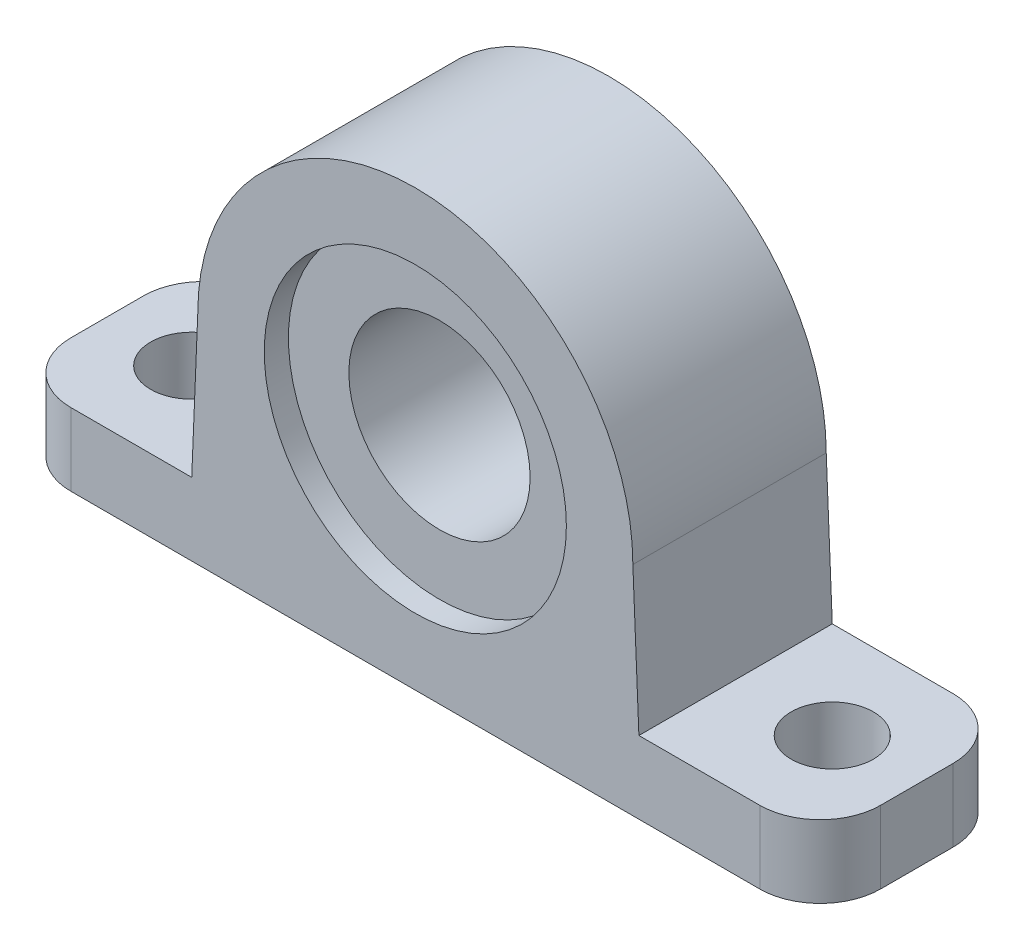
ISO-10303-21;
HEADER;
FILE_DESCRIPTION(('STEP AP214'),'2;1');
FILE_NAME('part.step','',(''),(''),'','','');
FILE_SCHEMA(('AUTOMOTIVE_DESIGN { 1 0 10303 214 1 1 1 1 }'));
ENDSEC;
DATA;
#1=APPLICATION_CONTEXT('core data for automotive mechanical design processes');
#2=APPLICATION_PROTOCOL_DEFINITION('international standard','automotive_design',2000,#1);
#3=PRODUCT_CONTEXT('',#1,'mechanical');
#4=PRODUCT('Part','Part','',(#3));
#5=PRODUCT_RELATED_PRODUCT_CATEGORY('part','',(#4));
#6=PRODUCT_DEFINITION_FORMATION('','',#4);
#7=PRODUCT_DEFINITION_CONTEXT('part definition',#1,'design');
#8=PRODUCT_DEFINITION('design','',#6,#7);
#9=PRODUCT_DEFINITION_SHAPE('','',#8);
#10=(LENGTH_UNIT() NAMED_UNIT(*) SI_UNIT(.MILLI.,.METRE.));
#11=(NAMED_UNIT(*) PLANE_ANGLE_UNIT() SI_UNIT($,.RADIAN.));
#12=(NAMED_UNIT(*) SI_UNIT($,.STERADIAN.) SOLID_ANGLE_UNIT());
#13=UNCERTAINTY_MEASURE_WITH_UNIT(LENGTH_MEASURE(1.E-05),#10,'distance_accuracy_value','');
#14=(GEOMETRIC_REPRESENTATION_CONTEXT(3) GLOBAL_UNCERTAINTY_ASSIGNED_CONTEXT((#13)) GLOBAL_UNIT_ASSIGNED_CONTEXT((#10,
#11,#12)) REPRESENTATION_CONTEXT('',''));
#15=CARTESIAN_POINT('',(0.,0.,0.));
#16=DIRECTION('',(0.,0.,1.));
#17=DIRECTION('',(1.,0.,0.));
#18=AXIS2_PLACEMENT_3D('',#15,#16,#17);
#19=CARTESIAN_POINT('',(-5.94368208875187,13.7784552845528,2.));
#20=DIRECTION('',(0.,0.,1.));
#21=DIRECTION('',(1.,0.,0.));
#22=AXIS2_PLACEMENT_3D('',#19,#20,#21);
#23=PLANE('',#22);
#24=CARTESIAN_POINT('',(-5.94368208875187,13.7784552845528,2.));
#25=DIRECTION('',(0.,0.,1.));
#26=DIRECTION('',(1.,0.,0.));
#27=AXIS2_PLACEMENT_3D('',#24,#25,#26);
#28=CIRCLE('',#27,12.5);
#29=CARTESIAN_POINT('',(6.55631791124813,13.7784552845528,2.));
#30=VERTEX_POINT('',#29);
#31=EDGE_CURVE('E258',#30,#30,#28,.T.);
#32=ORIENTED_EDGE('',*,*,#31,.F.);
#33=EDGE_LOOP('',(#32));
#34=FACE_BOUND('',#33,.T.);
#35=CARTESIAN_POINT('',(-5.94368208875187,13.7784552845528,2.));
#36=DIRECTION('',(0.,0.,1.));
#37=DIRECTION('',(1.,0.,0.));
#38=AXIS2_PLACEMENT_3D('',#35,#36,#37);
#39=CIRCLE('',#38,8.5);
#40=CARTESIAN_POINT('',(2.55631791124813,13.7784552845528,2.));
#41=VERTEX_POINT('',#40);
#42=EDGE_CURVE('E161',#41,#41,#39,.F.);
#43=ORIENTED_EDGE('',*,*,#42,.F.);
#44=EDGE_LOOP('',(#43));
#45=FACE_BOUND('',#44,.T.);
#46=ADVANCED_FACE('F41',(#34,#45),#23,.F.);
#47=CARTESIAN_POINT('',(-5.94368208875187,13.7784552845528,16.));
#48=DIRECTION('',(0.,0.,-1.));
#49=DIRECTION('',(-1.,0.,0.));
#50=AXIS2_PLACEMENT_3D('',#47,#48,#49);
#51=CYLINDRICAL_SURFACE('',#50,7.5);
#52=CARTESIAN_POINT('',(-5.94368208875187,13.7784552845528,14.));
#53=DIRECTION('',(0.,0.,1.));
#54=DIRECTION('',(1.,0.,0.));
#55=AXIS2_PLACEMENT_3D('',#52,#53,#54);
#56=CIRCLE('',#55,7.5);
#57=CARTESIAN_POINT('',(1.55631791124813,13.7784552845528,14.));
#58=VERTEX_POINT('',#57);
#59=EDGE_CURVE('E173',#58,#58,#56,.T.);
#60=ORIENTED_EDGE('',*,*,#59,.T.);
#61=EDGE_LOOP('',(#60));
#62=FACE_BOUND('',#61,.T.);
#63=CARTESIAN_POINT('',(-5.94368208875187,13.7784552845528,-3.));
#64=DIRECTION('',(0.,0.,-1.));
#65=DIRECTION('',(-1.,0.,0.));
#66=AXIS2_PLACEMENT_3D('',#63,#64,#65);
#67=CIRCLE('',#66,7.5);
#68=CARTESIAN_POINT('',(-13.4436820887519,13.7784552845528,-3.));
#69=VERTEX_POINT('',#68);
#70=EDGE_CURVE('E243',#69,#69,#67,.T.);
#71=ORIENTED_EDGE('',*,*,#70,.T.);
#72=EDGE_LOOP('',(#71));
#73=FACE_BOUND('',#72,.T.);
#74=ADVANCED_FACE('F350',(#62,#73),#51,.F.);
#75=CARTESIAN_POINT('',(-5.94368208875187,13.7784552845528,16.));
#76=DIRECTION('',(0.,0.,1.));
#77=DIRECTION('',(1.,0.,0.));
#78=AXIS2_PLACEMENT_3D('',#75,#76,#77);
#79=PLANE('',#78);
#80=CARTESIAN_POINT('',(-5.94368208875187,13.7784552845528,16.));
#81=DIRECTION('',(0.,0.,1.));
#82=DIRECTION('',(1.,0.,0.));
#83=AXIS2_PLACEMENT_3D('',#80,#81,#82);
#84=CIRCLE('',#83,12.5);
#85=CARTESIAN_POINT('',(6.55631791124813,13.7784552845528,16.));
#86=VERTEX_POINT('',#85);
#87=EDGE_CURVE('E251',#86,#86,#84,.T.);
#88=ORIENTED_EDGE('',*,*,#87,.F.);
#89=EDGE_LOOP('',(#88));
#90=FACE_BOUND('',#89,.T.);
#91=DIRECTION('',(1.,0.,0.));
#92=VECTOR('',#91,1.);
#93=CARTESIAN_POINT('',(-39.4436820887519,-4.22154471544718,16.));
#94=LINE('',#93,#92);
#95=CARTESIAN_POINT('',(-34.4436820887519,-4.22154471544718,16.));
#96=VERTEX_POINT('',#95);
#97=CARTESIAN_POINT('',(22.5563179112481,-4.22154471544718,16.));
#98=VERTEX_POINT('',#97);
#99=EDGE_CURVE('E143',#96,#98,#94,.T.);
#100=ORIENTED_EDGE('',*,*,#99,.T.);
#101=DIRECTION('',(0.,1.,0.));
#102=VECTOR('',#101,1.);
#103=CARTESIAN_POINT('',(22.5563179112481,1.77845528455283,16.));
#104=LINE('',#103,#102);
#105=CARTESIAN_POINT('',(22.5563179112481,1.77845528455283,16.));
#106=VERTEX_POINT('',#105);
#107=EDGE_CURVE('E196',#98,#106,#104,.T.);
#108=ORIENTED_EDGE('',*,*,#107,.T.);
#109=DIRECTION('',(-1.,0.,0.));
#110=VECTOR('',#109,1.);
#111=CARTESIAN_POINT('',(27.5563179112481,1.77845528455283,16.));
#112=LINE('',#111,#110);
#113=CARTESIAN_POINT('',(12.5563179112481,1.77845528455283,16.));
#114=VERTEX_POINT('',#113);
#115=EDGE_CURVE('E267',#106,#114,#112,.T.);
#116=ORIENTED_EDGE('',*,*,#115,.T.);
#117=DIRECTION('',(-0.0416305447121817,0.999133073092352,0.));
#118=VECTOR('',#117,1.);
#119=CARTESIAN_POINT('',(12.0563179112481,13.7784552845528,16.));
#120=LINE('',#119,#118);
#121=CARTESIAN_POINT('',(12.0563179112481,13.7784552845528,16.));
#122=VERTEX_POINT('',#121);
#123=EDGE_CURVE('E270',#114,#122,#120,.T.);
#124=ORIENTED_EDGE('',*,*,#123,.T.);
#125=CARTESIAN_POINT('',(-5.94368208875187,13.7784552845528,16.));
#126=DIRECTION('',(0.,0.,1.));
#127=DIRECTION('',(1.,0.,0.));
#128=AXIS2_PLACEMENT_3D('',#125,#126,#127);
#129=CIRCLE('',#128,18.);
#130=CARTESIAN_POINT('',(-23.9436820887519,13.7784552845528,16.));
#131=VERTEX_POINT('',#130);
#132=EDGE_CURVE('E150',#122,#131,#129,.T.);
#133=ORIENTED_EDGE('',*,*,#132,.T.);
#134=DIRECTION('',(-0.0416305447121817,-0.999133073092352,0.));
#135=VECTOR('',#134,1.);
#136=CARTESIAN_POINT('',(-23.9436820887519,13.7784552845528,16.));
#137=LINE('',#136,#135);
#138=CARTESIAN_POINT('',(-24.4436820887519,1.77845528455283,16.));
#139=VERTEX_POINT('',#138);
#140=EDGE_CURVE('E144',#131,#139,#137,.T.);
#141=ORIENTED_EDGE('',*,*,#140,.T.);
#142=DIRECTION('',(-1.,0.,0.));
#143=VECTOR('',#142,1.);
#144=CARTESIAN_POINT('',(-24.4436820887519,1.77845528455283,16.));
#145=LINE('',#144,#143);
#146=CARTESIAN_POINT('',(-34.4436820887519,1.77845528455282,16.));
#147=VERTEX_POINT('',#146);
#148=EDGE_CURVE('E132',#139,#147,#145,.T.);
#149=ORIENTED_EDGE('',*,*,#148,.T.);
#150=DIRECTION('',(0.,-1.,0.));
#151=VECTOR('',#150,1.);
#152=CARTESIAN_POINT('',(-34.4436820887519,-4.22154471544718,16.));
#153=LINE('',#152,#151);
#154=EDGE_CURVE('E193',#147,#96,#153,.T.);
#155=ORIENTED_EDGE('',*,*,#154,.T.);
#156=EDGE_LOOP('',(#100,#108,#116,#124,#133,#141,#149,#155));
#157=FACE_BOUND('',#156,.T.);
#158=ADVANCED_FACE('F148',(#90,#157),#79,.T.);
#159=CARTESIAN_POINT('',(-5.94368208875187,13.7784552845528,0.));
#160=DIRECTION('',(0.,0.,1.));
#161=DIRECTION('',(1.,0.,0.));
#162=AXIS2_PLACEMENT_3D('',#159,#160,#161);
#163=PLANE('',#162);
#164=CARTESIAN_POINT('',(-5.94368208875187,13.7784552845528,0.));
#165=DIRECTION('',(0.,0.,1.));
#166=DIRECTION('',(1.,0.,0.));
#167=AXIS2_PLACEMENT_3D('',#164,#165,#166);
#168=CIRCLE('',#167,12.5);
#169=CARTESIAN_POINT('',(6.55631791124813,13.7784552845528,0.));
#170=VERTEX_POINT('',#169);
#171=EDGE_CURVE('E176',#170,#170,#168,.T.);
#172=ORIENTED_EDGE('',*,*,#171,.T.);
#173=EDGE_LOOP('',(#172));
#174=FACE_BOUND('',#173,.T.);
#175=DIRECTION('',(1.,0.,0.));
#176=VECTOR('',#175,1.);
#177=CARTESIAN_POINT('',(-39.4436820887519,-4.22154471544718,0.));
#178=LINE('',#177,#176);
#179=CARTESIAN_POINT('',(-34.4436820887519,-4.22154471544718,0.));
#180=VERTEX_POINT('',#179);
#181=CARTESIAN_POINT('',(22.5563179112481,-4.22154471544718,0.));
#182=VERTEX_POINT('',#181);
#183=EDGE_CURVE('E281',#180,#182,#178,.T.);
#184=ORIENTED_EDGE('',*,*,#183,.F.);
#185=DIRECTION('',(0.,-1.,0.));
#186=VECTOR('',#185,1.);
#187=CARTESIAN_POINT('',(-34.4436820887519,13.7784552845528,0.));
#188=LINE('',#187,#186);
#189=CARTESIAN_POINT('',(-34.4436820887519,1.77845528455282,0.));
#190=VERTEX_POINT('',#189);
#191=EDGE_CURVE('E11',#180,#190,#188,.F.);
#192=ORIENTED_EDGE('',*,*,#191,.T.);
#193=DIRECTION('',(-1.,0.,0.));
#194=VECTOR('',#193,1.);
#195=CARTESIAN_POINT('',(-24.4436820887519,1.77845528455283,0.));
#196=LINE('',#195,#194);
#197=CARTESIAN_POINT('',(-24.4436820887519,1.77845528455283,0.));
#198=VERTEX_POINT('',#197);
#199=EDGE_CURVE('E278',#198,#190,#196,.T.);
#200=ORIENTED_EDGE('',*,*,#199,.F.);
#201=DIRECTION('',(-0.0416305447121817,-0.999133073092352,0.));
#202=VECTOR('',#201,1.);
#203=CARTESIAN_POINT('',(-23.9436820887519,13.7784552845528,0.));
#204=LINE('',#203,#202);
#205=CARTESIAN_POINT('',(-23.9436820887519,13.7784552845528,0.));
#206=VERTEX_POINT('',#205);
#207=EDGE_CURVE('E159',#206,#198,#204,.T.);
#208=ORIENTED_EDGE('',*,*,#207,.F.);
#209=CARTESIAN_POINT('',(-5.94368208875187,13.7784552845528,0.));
#210=DIRECTION('',(0.,0.,1.));
#211=DIRECTION('',(1.,0.,0.));
#212=AXIS2_PLACEMENT_3D('',#209,#210,#211);
#213=CIRCLE('',#212,18.);
#214=CARTESIAN_POINT('',(12.0563179112481,13.7784552845528,0.));
#215=VERTEX_POINT('',#214);
#216=EDGE_CURVE('E155',#215,#206,#213,.T.);
#217=ORIENTED_EDGE('',*,*,#216,.F.);
#218=DIRECTION('',(-0.0416305447121817,0.999133073092352,0.));
#219=VECTOR('',#218,1.);
#220=CARTESIAN_POINT('',(12.0563179112481,13.7784552845528,0.));
#221=LINE('',#220,#219);
#222=CARTESIAN_POINT('',(12.5563179112481,1.77845528455283,0.));
#223=VERTEX_POINT('',#222);
#224=EDGE_CURVE('E287',#223,#215,#221,.T.);
#225=ORIENTED_EDGE('',*,*,#224,.F.);
#226=DIRECTION('',(-1.,0.,0.));
#227=VECTOR('',#226,1.);
#228=CARTESIAN_POINT('',(27.5563179112481,1.77845528455283,0.));
#229=LINE('',#228,#227);
#230=CARTESIAN_POINT('',(22.5563179112481,1.77845528455283,0.));
#231=VERTEX_POINT('',#230);
#232=EDGE_CURVE('E284',#231,#223,#229,.T.);
#233=ORIENTED_EDGE('',*,*,#232,.F.);
#234=DIRECTION('',(0.,1.,0.));
#235=VECTOR('',#234,1.);
#236=CARTESIAN_POINT('',(22.5563179112481,13.7784552845528,0.));
#237=LINE('',#236,#235);
#238=EDGE_CURVE('E185',#231,#182,#237,.F.);
#239=ORIENTED_EDGE('',*,*,#238,.T.);
#240=EDGE_LOOP('',(#184,#192,#200,#208,#217,#225,#233,#239));
#241=FACE_BOUND('',#240,.T.);
#242=ADVANCED_FACE('F339',(#174,#241),#163,.F.);
#243=CARTESIAN_POINT('',(-23.9436820887519,13.7784552845528,16.));
#244=DIRECTION('',(0.999133073092352,-0.0416305447121817,0.));
#245=DIRECTION('',(0.0416305447121817,0.999133073092352,0.));
#246=AXIS2_PLACEMENT_3D('',#243,#244,#245);
#247=PLANE('',#246);
#248=ORIENTED_EDGE('',*,*,#207,.T.);
#249=DIRECTION('',(0.,0.,-1.));
#250=VECTOR('',#249,1.);
#251=CARTESIAN_POINT('',(-24.4436820887519,1.77845528455283,16.));
#252=LINE('',#251,#250);
#253=EDGE_CURVE('E136',#139,#198,#252,.T.);
#254=ORIENTED_EDGE('',*,*,#253,.F.);
#255=ORIENTED_EDGE('',*,*,#140,.F.);
#256=DIRECTION('',(0.,0.,-1.));
#257=VECTOR('',#256,1.);
#258=CARTESIAN_POINT('',(-23.9436820887519,13.7784552845528,16.));
#259=LINE('',#258,#257);
#260=EDGE_CURVE('E275',#131,#206,#259,.T.);
#261=ORIENTED_EDGE('',*,*,#260,.T.);
#262=EDGE_LOOP('',(#248,#254,#255,#261));
#263=FACE_BOUND('',#262,.T.);
#264=ADVANCED_FACE('F157',(#263),#247,.F.);
#265=CARTESIAN_POINT('',(-24.4436820887519,1.77845528455283,16.));
#266=DIRECTION('',(0.,-1.,0.));
#267=DIRECTION('',(1.,0.,0.));
#268=AXIS2_PLACEMENT_3D('',#265,#266,#267);
#269=PLANE('',#268);
#270=CARTESIAN_POINT('',(-32.4436820887519,1.77845528455282,8.00000000000001));
#271=DIRECTION('',(0.,-1.,0.));
#272=DIRECTION('',(1.,0.,0.));
#273=AXIS2_PLACEMENT_3D('',#270,#271,#272);
#274=CIRCLE('',#273,3.4);
#275=CARTESIAN_POINT('',(-29.0436820887519,1.77845528455282,8.00000000000001));
#276=VERTEX_POINT('',#275);
#277=EDGE_CURVE('E238',#276,#276,#274,.F.);
#278=ORIENTED_EDGE('',*,*,#277,.F.);
#279=EDGE_LOOP('',(#278));
#280=FACE_BOUND('',#279,.T.);
#281=DIRECTION('',(0.,0.,-1.));
#282=VECTOR('',#281,1.);
#283=CARTESIAN_POINT('',(-39.4436820887519,1.77845528455282,16.));
#284=LINE('',#283,#282);
#285=CARTESIAN_POINT('',(-39.4436820887519,1.77845528455282,11.));
#286=VERTEX_POINT('',#285);
#287=CARTESIAN_POINT('',(-39.4436820887519,1.77845528455282,5.));
#288=VERTEX_POINT('',#287);
#289=EDGE_CURVE('E162',#286,#288,#284,.T.);
#290=ORIENTED_EDGE('',*,*,#289,.F.);
#291=CARTESIAN_POINT('',(-34.4436820887519,1.77845528455282,11.));
#292=DIRECTION('',(0.,-1.,0.));
#293=DIRECTION('',(1.,0.,0.));
#294=AXIS2_PLACEMENT_3D('',#291,#292,#293);
#295=CIRCLE('',#294,5.);
#296=EDGE_CURVE('E51',#286,#147,#295,.F.);
#297=ORIENTED_EDGE('',*,*,#296,.T.);
#298=ORIENTED_EDGE('',*,*,#148,.F.);
#299=ORIENTED_EDGE('',*,*,#253,.T.);
#300=ORIENTED_EDGE('',*,*,#199,.T.);
#301=CARTESIAN_POINT('',(-34.4436820887519,1.77845528455282,5.));
#302=DIRECTION('',(0.,-1.,0.));
#303=DIRECTION('',(1.,0.,0.));
#304=AXIS2_PLACEMENT_3D('',#301,#302,#303);
#305=CIRCLE('',#304,5.);
#306=EDGE_CURVE('E64',#190,#288,#305,.F.);
#307=ORIENTED_EDGE('',*,*,#306,.T.);
#308=EDGE_LOOP('',(#290,#297,#298,#299,#300,#307));
#309=FACE_BOUND('',#308,.T.);
#310=ADVANCED_FACE('F134',(#280,#309),#269,.F.);
#311=CARTESIAN_POINT('',(-39.4436820887519,1.77845528455282,16.));
#312=DIRECTION('',(1.,0.,0.));
#313=DIRECTION('',(0.,0.,-1.));
#314=AXIS2_PLACEMENT_3D('',#311,#312,#313);
#315=PLANE('',#314);
#316=DIRECTION('',(0.,0.,-1.));
#317=VECTOR('',#316,1.);
#318=CARTESIAN_POINT('',(-39.4436820887519,-4.22154471544718,16.));
#319=LINE('',#318,#317);
#320=CARTESIAN_POINT('',(-39.4436820887519,-4.22154471544718,11.));
#321=VERTEX_POINT('',#320);
#322=CARTESIAN_POINT('',(-39.4436820887519,-4.22154471544718,5.));
#323=VERTEX_POINT('',#322);
#324=EDGE_CURVE('E169',#321,#323,#319,.T.);
#325=ORIENTED_EDGE('',*,*,#324,.F.);
#326=DIRECTION('',(0.,-1.,0.));
#327=VECTOR('',#326,1.);
#328=CARTESIAN_POINT('',(-39.4436820887519,1.77845528455282,11.));
#329=LINE('',#328,#327);
#330=EDGE_CURVE('E219',#321,#286,#329,.F.);
#331=ORIENTED_EDGE('',*,*,#330,.T.);
#332=ORIENTED_EDGE('',*,*,#289,.T.);
#333=DIRECTION('',(0.,-1.,0.));
#334=VECTOR('',#333,1.);
#335=CARTESIAN_POINT('',(-39.4436820887519,1.77845528455282,5.));
#336=LINE('',#335,#334);
#337=EDGE_CURVE('E215',#288,#323,#336,.T.);
#338=ORIENTED_EDGE('',*,*,#337,.T.);
#339=EDGE_LOOP('',(#325,#331,#332,#338));
#340=FACE_BOUND('',#339,.T.);
#341=ADVANCED_FACE('F316',(#340),#315,.F.);
#342=CARTESIAN_POINT('',(-39.4436820887519,-4.22154471544718,16.));
#343=DIRECTION('',(0.,1.,0.));
#344=DIRECTION('',(0.,0.,1.));
#345=AXIS2_PLACEMENT_3D('',#342,#343,#344);
#346=PLANE('',#345);
#347=CARTESIAN_POINT('',(-32.4436820887519,-4.22154471544717,8.00000000000001));
#348=DIRECTION('',(0.,1.,0.));
#349=DIRECTION('',(0.,0.,1.));
#350=AXIS2_PLACEMENT_3D('',#347,#348,#349);
#351=CIRCLE('',#350,3.4);
#352=CARTESIAN_POINT('',(-32.4436820887519,-4.22154471544717,11.4));
#353=VERTEX_POINT('',#352);
#354=EDGE_CURVE('E45',#353,#353,#351,.F.);
#355=ORIENTED_EDGE('',*,*,#354,.F.);
#356=EDGE_LOOP('',(#355));
#357=FACE_BOUND('',#356,.T.);
#358=CARTESIAN_POINT('',(20.5563179112481,-4.22154471544717,8.00000000000001));
#359=DIRECTION('',(0.,1.,0.));
#360=DIRECTION('',(0.,0.,1.));
#361=AXIS2_PLACEMENT_3D('',#358,#359,#360);
#362=CIRCLE('',#361,3.4);
#363=CARTESIAN_POINT('',(20.5563179112481,-4.22154471544717,11.4));
#364=VERTEX_POINT('',#363);
#365=EDGE_CURVE('E228',#364,#364,#362,.F.);
#366=ORIENTED_EDGE('',*,*,#365,.F.);
#367=EDGE_LOOP('',(#366));
#368=FACE_BOUND('',#367,.T.);
#369=DIRECTION('',(0.,0.,-1.));
#370=VECTOR('',#369,1.);
#371=CARTESIAN_POINT('',(27.5563179112481,-4.22154471544718,16.));
#372=LINE('',#371,#370);
#373=CARTESIAN_POINT('',(27.5563179112481,-4.22154471544718,11.));
#374=VERTEX_POINT('',#373);
#375=CARTESIAN_POINT('',(27.5563179112481,-4.22154471544718,5.));
#376=VERTEX_POINT('',#375);
#377=EDGE_CURVE('E305',#374,#376,#372,.T.);
#378=ORIENTED_EDGE('',*,*,#377,.F.);
#379=CARTESIAN_POINT('',(22.5563179112481,-4.22154471544718,11.));
#380=DIRECTION('',(0.,1.,0.));
#381=DIRECTION('',(0.,0.,1.));
#382=AXIS2_PLACEMENT_3D('',#379,#380,#381);
#383=CIRCLE('',#382,5.);
#384=EDGE_CURVE('E212',#374,#98,#383,.F.);
#385=ORIENTED_EDGE('',*,*,#384,.T.);
#386=ORIENTED_EDGE('',*,*,#99,.F.);
#387=CARTESIAN_POINT('',(-34.4436820887519,-4.22154471544718,11.));
#388=DIRECTION('',(0.,1.,0.));
#389=DIRECTION('',(0.,0.,1.));
#390=AXIS2_PLACEMENT_3D('',#387,#388,#389);
#391=CIRCLE('',#390,5.);
#392=EDGE_CURVE('E209',#96,#321,#391,.F.);
#393=ORIENTED_EDGE('',*,*,#392,.T.);
#394=ORIENTED_EDGE('',*,*,#324,.T.);
#395=CARTESIAN_POINT('',(-34.4436820887519,-4.22154471544718,5.));
#396=DIRECTION('',(0.,1.,0.));
#397=DIRECTION('',(0.,0.,1.));
#398=AXIS2_PLACEMENT_3D('',#395,#396,#397);
#399=CIRCLE('',#398,5.);
#400=EDGE_CURVE('E206',#323,#180,#399,.F.);
#401=ORIENTED_EDGE('',*,*,#400,.T.);
#402=ORIENTED_EDGE('',*,*,#183,.T.);
#403=CARTESIAN_POINT('',(22.5563179112481,-4.22154471544718,5.));
#404=DIRECTION('',(0.,1.,0.));
#405=DIRECTION('',(0.,0.,1.));
#406=AXIS2_PLACEMENT_3D('',#403,#404,#405);
#407=CIRCLE('',#406,5.);
#408=EDGE_CURVE('E189',#182,#376,#407,.F.);
#409=ORIENTED_EDGE('',*,*,#408,.T.);
#410=EDGE_LOOP('',(#378,#385,#386,#393,#394,#401,#402,#409));
#411=FACE_BOUND('',#410,.T.);
#412=ADVANCED_FACE('F312',(#357,#368,#411),#346,.F.);
#413=CARTESIAN_POINT('',(27.5563179112481,-4.22154471544718,16.));
#414=DIRECTION('',(-1.,0.,0.));
#415=DIRECTION('',(0.,0.,1.));
#416=AXIS2_PLACEMENT_3D('',#413,#414,#415);
#417=PLANE('',#416);
#418=DIRECTION('',(0.,0.,-1.));
#419=VECTOR('',#418,1.);
#420=CARTESIAN_POINT('',(27.5563179112481,1.77845528455283,16.));
#421=LINE('',#420,#419);
#422=CARTESIAN_POINT('',(27.5563179112481,1.77845528455283,11.));
#423=VERTEX_POINT('',#422);
#424=CARTESIAN_POINT('',(27.5563179112481,1.77845528455283,5.));
#425=VERTEX_POINT('',#424);
#426=EDGE_CURVE('E302',#423,#425,#421,.T.);
#427=ORIENTED_EDGE('',*,*,#426,.F.);
#428=DIRECTION('',(0.,1.,0.));
#429=VECTOR('',#428,1.);
#430=CARTESIAN_POINT('',(27.5563179112481,-4.22154471544718,11.));
#431=LINE('',#430,#429);
#432=EDGE_CURVE('E203',#423,#374,#431,.F.);
#433=ORIENTED_EDGE('',*,*,#432,.T.);
#434=ORIENTED_EDGE('',*,*,#377,.T.);
#435=DIRECTION('',(0.,1.,0.));
#436=VECTOR('',#435,1.);
#437=CARTESIAN_POINT('',(27.5563179112481,-4.22154471544718,5.));
#438=LINE('',#437,#436);
#439=EDGE_CURVE('E167',#376,#425,#438,.T.);
#440=ORIENTED_EDGE('',*,*,#439,.T.);
#441=EDGE_LOOP('',(#427,#433,#434,#440));
#442=FACE_BOUND('',#441,.T.);
#443=ADVANCED_FACE('F380',(#442),#417,.F.);
#444=CARTESIAN_POINT('',(27.5563179112481,1.77845528455283,16.));
#445=DIRECTION('',(0.,-1.,0.));
#446=DIRECTION('',(1.,0.,0.));
#447=AXIS2_PLACEMENT_3D('',#444,#445,#446);
#448=PLANE('',#447);
#449=CARTESIAN_POINT('',(20.5563179112481,1.77845528455283,8.00000000000001));
#450=DIRECTION('',(0.,-1.,0.));
#451=DIRECTION('',(1.,0.,0.));
#452=AXIS2_PLACEMENT_3D('',#449,#450,#451);
#453=CIRCLE('',#452,3.4);
#454=CARTESIAN_POINT('',(23.9563179112481,1.77845528455283,8.00000000000001));
#455=VERTEX_POINT('',#454);
#456=EDGE_CURVE('E225',#455,#455,#453,.F.);
#457=ORIENTED_EDGE('',*,*,#456,.F.);
#458=EDGE_LOOP('',(#457));
#459=FACE_BOUND('',#458,.T.);
#460=ORIENTED_EDGE('',*,*,#115,.F.);
#461=CARTESIAN_POINT('',(22.5563179112481,1.77845528455283,11.));
#462=DIRECTION('',(0.,-1.,0.));
#463=DIRECTION('',(1.,0.,0.));
#464=AXIS2_PLACEMENT_3D('',#461,#462,#463);
#465=CIRCLE('',#464,5.);
#466=EDGE_CURVE('E200',#106,#423,#465,.F.);
#467=ORIENTED_EDGE('',*,*,#466,.T.);
#468=ORIENTED_EDGE('',*,*,#426,.T.);
#469=CARTESIAN_POINT('',(22.5563179112481,1.77845528455283,5.));
#470=DIRECTION('',(0.,-1.,0.));
#471=DIRECTION('',(1.,0.,0.));
#472=AXIS2_PLACEMENT_3D('',#469,#470,#471);
#473=CIRCLE('',#472,5.);
#474=EDGE_CURVE('E182',#425,#231,#473,.F.);
#475=ORIENTED_EDGE('',*,*,#474,.T.);
#476=ORIENTED_EDGE('',*,*,#232,.T.);
#477=DIRECTION('',(0.,0.,-1.));
#478=VECTOR('',#477,1.);
#479=CARTESIAN_POINT('',(12.5563179112481,1.77845528455283,16.));
#480=LINE('',#479,#478);
#481=EDGE_CURVE('E298',#114,#223,#480,.T.);
#482=ORIENTED_EDGE('',*,*,#481,.F.);
#483=EDGE_LOOP('',(#460,#467,#468,#475,#476,#482));
#484=FACE_BOUND('',#483,.T.);
#485=ADVANCED_FACE('F328',(#459,#484),#448,.F.);
#486=CARTESIAN_POINT('',(12.0563179112481,13.7784552845528,16.));
#487=DIRECTION('',(-0.999133073092352,-0.0416305447121817,0.));
#488=DIRECTION('',(0.0416305447121817,-0.999133073092352,0.));
#489=AXIS2_PLACEMENT_3D('',#486,#487,#488);
#490=PLANE('',#489);
#491=ORIENTED_EDGE('',*,*,#224,.T.);
#492=DIRECTION('',(0.,0.,-1.));
#493=VECTOR('',#492,1.);
#494=CARTESIAN_POINT('',(12.0563179112481,13.7784552845528,16.));
#495=LINE('',#494,#493);
#496=EDGE_CURVE('E294',#122,#215,#495,.T.);
#497=ORIENTED_EDGE('',*,*,#496,.F.);
#498=ORIENTED_EDGE('',*,*,#123,.F.);
#499=ORIENTED_EDGE('',*,*,#481,.T.);
#500=EDGE_LOOP('',(#491,#497,#498,#499));
#501=FACE_BOUND('',#500,.T.);
#502=ADVANCED_FACE('F335',(#501),#490,.F.);
#503=CARTESIAN_POINT('',(-5.94368208875187,13.7784552845528,16.));
#504=DIRECTION('',(0.,0.,-1.));
#505=DIRECTION('',(-1.,0.,0.));
#506=AXIS2_PLACEMENT_3D('',#503,#504,#505);
#507=CYLINDRICAL_SURFACE('',#506,18.);
#508=ORIENTED_EDGE('',*,*,#216,.T.);
#509=ORIENTED_EDGE('',*,*,#260,.F.);
#510=ORIENTED_EDGE('',*,*,#132,.F.);
#511=ORIENTED_EDGE('',*,*,#496,.T.);
#512=EDGE_LOOP('',(#508,#509,#510,#511));
#513=FACE_BOUND('',#512,.T.);
#514=ADVANCED_FACE('F338',(#513),#507,.T.);
#515=CARTESIAN_POINT('',(-5.94368208875187,13.7784552845528,2.));
#516=DIRECTION('',(0.,0.,-1.));
#517=DIRECTION('',(-1.,0.,0.));
#518=AXIS2_PLACEMENT_3D('',#515,#516,#517);
#519=CYLINDRICAL_SURFACE('',#518,12.5);
#520=ORIENTED_EDGE('',*,*,#31,.T.);
#521=EDGE_LOOP('',(#520));
#522=FACE_BOUND('',#521,.T.);
#523=ORIENTED_EDGE('',*,*,#171,.F.);
#524=EDGE_LOOP('',(#523));
#525=FACE_BOUND('',#524,.T.);
#526=ADVANCED_FACE('F364',(#522,#525),#519,.F.);
#527=CARTESIAN_POINT('',(-5.94368208875187,13.7784552845528,14.));
#528=DIRECTION('',(0.,0.,1.));
#529=DIRECTION('',(1.,0.,0.));
#530=AXIS2_PLACEMENT_3D('',#527,#528,#529);
#531=CYLINDRICAL_SURFACE('',#530,12.5);
#532=CARTESIAN_POINT('',(-5.94368208875187,13.7784552845528,14.));
#533=DIRECTION('',(0.,0.,1.));
#534=DIRECTION('',(1.,0.,0.));
#535=AXIS2_PLACEMENT_3D('',#532,#533,#534);
#536=CIRCLE('',#535,12.5);
#537=CARTESIAN_POINT('',(6.55631791124813,13.7784552845528,14.));
#538=VERTEX_POINT('',#537);
#539=EDGE_CURVE('E177',#538,#538,#536,.T.);
#540=ORIENTED_EDGE('',*,*,#539,.F.);
#541=EDGE_LOOP('',(#540));
#542=FACE_BOUND('',#541,.T.);
#543=ORIENTED_EDGE('',*,*,#87,.T.);
#544=EDGE_LOOP('',(#543));
#545=FACE_BOUND('',#544,.T.);
#546=ADVANCED_FACE('F362',(#542,#545),#531,.F.);
#547=CARTESIAN_POINT('',(-5.94368208875187,13.7784552845528,14.));
#548=DIRECTION('',(0.,0.,1.));
#549=DIRECTION('',(1.,0.,0.));
#550=AXIS2_PLACEMENT_3D('',#547,#548,#549);
#551=PLANE('',#550);
#552=ORIENTED_EDGE('',*,*,#59,.F.);
#553=EDGE_LOOP('',(#552));
#554=FACE_BOUND('',#553,.T.);
#555=ORIENTED_EDGE('',*,*,#539,.T.);
#556=EDGE_LOOP('',(#555));
#557=FACE_BOUND('',#556,.T.);
#558=ADVANCED_FACE('F501',(#554,#557),#551,.T.);
#559=CARTESIAN_POINT('',(-5.94368208875187,13.7784552845528,-3.));
#560=DIRECTION('',(0.,0.,-1.));
#561=DIRECTION('',(-1.,0.,0.));
#562=AXIS2_PLACEMENT_3D('',#559,#560,#561);
#563=PLANE('',#562);
#564=CARTESIAN_POINT('',(-5.94368208875187,13.7784552845528,-3.));
#565=DIRECTION('',(0.,0.,-1.));
#566=DIRECTION('',(-1.,0.,0.));
#567=AXIS2_PLACEMENT_3D('',#564,#565,#566);
#568=CIRCLE('',#567,8.5);
#569=CARTESIAN_POINT('',(-14.4436820887519,13.7784552845528,-3.));
#570=VERTEX_POINT('',#569);
#571=EDGE_CURVE('E247',#570,#570,#568,.T.);
#572=ORIENTED_EDGE('',*,*,#571,.T.);
#573=EDGE_LOOP('',(#572));
#574=FACE_BOUND('',#573,.T.);
#575=ORIENTED_EDGE('',*,*,#70,.F.);
#576=EDGE_LOOP('',(#575));
#577=FACE_BOUND('',#576,.T.);
#578=ADVANCED_FACE('F506',(#574,#577),#563,.T.);
#579=CARTESIAN_POINT('',(-5.94368208875187,13.7784552845528,-3.));
#580=DIRECTION('',(0.,0.,1.));
#581=DIRECTION('',(1.,0.,0.));
#582=AXIS2_PLACEMENT_3D('',#579,#580,#581);
#583=CYLINDRICAL_SURFACE('',#582,8.5);
#584=ORIENTED_EDGE('',*,*,#571,.F.);
#585=EDGE_LOOP('',(#584));
#586=FACE_BOUND('',#585,.T.);
#587=ORIENTED_EDGE('',*,*,#42,.T.);
#588=EDGE_LOOP('',(#587));
#589=FACE_BOUND('',#588,.T.);
#590=ADVANCED_FACE('F398',(#586,#589),#583,.T.);
#591=CARTESIAN_POINT('',(22.5563179112481,-4.22154471544718,5.));
#592=DIRECTION('',(0.,1.,0.));
#593=DIRECTION('',(0.,0.,1.));
#594=AXIS2_PLACEMENT_3D('',#591,#592,#593);
#595=CYLINDRICAL_SURFACE('',#594,5.);
#596=ORIENTED_EDGE('',*,*,#408,.F.);
#597=ORIENTED_EDGE('',*,*,#238,.F.);
#598=ORIENTED_EDGE('',*,*,#474,.F.);
#599=ORIENTED_EDGE('',*,*,#439,.F.);
#600=EDGE_LOOP('',(#596,#597,#598,#599));
#601=FACE_BOUND('',#600,.T.);
#602=ADVANCED_FACE('F395',(#601),#595,.T.);
#603=CARTESIAN_POINT('',(22.5563179112481,13.7784552845528,11.));
#604=DIRECTION('',(0.,-1.,0.));
#605=DIRECTION('',(0.,0.,-1.));
#606=AXIS2_PLACEMENT_3D('',#603,#604,#605);
#607=CYLINDRICAL_SURFACE('',#606,5.);
#608=ORIENTED_EDGE('',*,*,#384,.F.);
#609=ORIENTED_EDGE('',*,*,#432,.F.);
#610=ORIENTED_EDGE('',*,*,#466,.F.);
#611=ORIENTED_EDGE('',*,*,#107,.F.);
#612=EDGE_LOOP('',(#608,#609,#610,#611));
#613=FACE_BOUND('',#612,.T.);
#614=ADVANCED_FACE('F324',(#613),#607,.T.);
#615=CARTESIAN_POINT('',(-34.4436820887519,13.7784552845528,11.));
#616=DIRECTION('',(0.,1.,0.));
#617=DIRECTION('',(0.,0.,1.));
#618=AXIS2_PLACEMENT_3D('',#615,#616,#617);
#619=CYLINDRICAL_SURFACE('',#618,5.);
#620=ORIENTED_EDGE('',*,*,#296,.F.);
#621=ORIENTED_EDGE('',*,*,#330,.F.);
#622=ORIENTED_EDGE('',*,*,#392,.F.);
#623=ORIENTED_EDGE('',*,*,#154,.F.);
#624=EDGE_LOOP('',(#620,#621,#622,#623));
#625=FACE_BOUND('',#624,.T.);
#626=ADVANCED_FACE('F319',(#625),#619,.T.);
#627=CARTESIAN_POINT('',(-34.4436820887519,1.77845528455282,5.));
#628=DIRECTION('',(0.,-1.,0.));
#629=DIRECTION('',(0.,0.,-1.));
#630=AXIS2_PLACEMENT_3D('',#627,#628,#629);
#631=CYLINDRICAL_SURFACE('',#630,5.);
#632=ORIENTED_EDGE('',*,*,#306,.F.);
#633=ORIENTED_EDGE('',*,*,#191,.F.);
#634=ORIENTED_EDGE('',*,*,#400,.F.);
#635=ORIENTED_EDGE('',*,*,#337,.F.);
#636=EDGE_LOOP('',(#632,#633,#634,#635));
#637=FACE_BOUND('',#636,.T.);
#638=ADVANCED_FACE('F43',(#637),#631,.T.);
#639=CARTESIAN_POINT('',(20.5563179112481,35.,8.00000000000001));
#640=DIRECTION('',(0.,-1.,0.));
#641=DIRECTION('',(0.,0.,-1.));
#642=AXIS2_PLACEMENT_3D('',#639,#640,#641);
#643=CYLINDRICAL_SURFACE('',#642,3.4);
#644=ORIENTED_EDGE('',*,*,#456,.T.);
#645=EDGE_LOOP('',(#644));
#646=FACE_BOUND('',#645,.T.);
#647=ORIENTED_EDGE('',*,*,#365,.T.);
#648=EDGE_LOOP('',(#647));
#649=FACE_BOUND('',#648,.T.);
#650=ADVANCED_FACE('F342',(#646,#649),#643,.F.);
#651=CARTESIAN_POINT('',(-32.4436820887519,35.,8.00000000000001));
#652=DIRECTION('',(0.,-1.,0.));
#653=DIRECTION('',(0.,0.,-1.));
#654=AXIS2_PLACEMENT_3D('',#651,#652,#653);
#655=CYLINDRICAL_SURFACE('',#654,3.4);
#656=ORIENTED_EDGE('',*,*,#354,.T.);
#657=EDGE_LOOP('',(#656));
#658=FACE_BOUND('',#657,.T.);
#659=ORIENTED_EDGE('',*,*,#277,.T.);
#660=EDGE_LOOP('',(#659));
#661=FACE_BOUND('',#660,.T.);
#662=ADVANCED_FACE('F347',(#658,#661),#655,.F.);
#663=CLOSED_SHELL('',(#46,#74,#158,#242,#264,#310,#341,#412,#443,#485,#502,#514,#526,#546,#558,
#578,#590,#602,#614,#626,#638,#650,#662));
#664=MANIFOLD_SOLID_BREP('B2',#663);
#665=ADVANCED_BREP_SHAPE_REPRESENTATION('',(#18,#664),#14);
#666=SHAPE_DEFINITION_REPRESENTATION(#9,#665);
ENDSEC;
END-ISO-10303-21;
